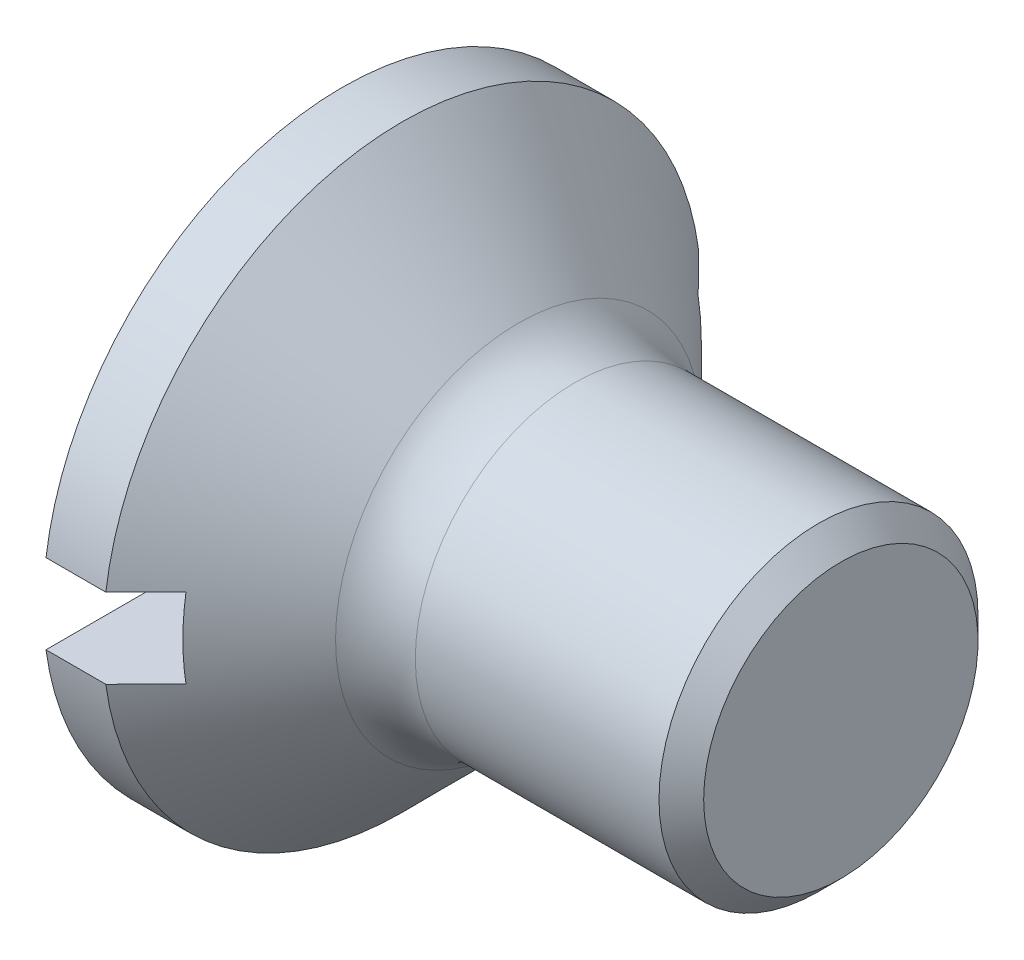
ISO-10303-21;
HEADER;
FILE_DESCRIPTION(('STEP AP214'),'2;1');
FILE_NAME('part.step','',(''),(''),'','','');
FILE_SCHEMA(('AUTOMOTIVE_DESIGN { 1 0 10303 214 1 1 1 1 }'));
ENDSEC;
DATA;
#1=APPLICATION_CONTEXT('core data for automotive mechanical design processes');
#2=APPLICATION_PROTOCOL_DEFINITION('international standard','automotive_design',2000,#1);
#3=PRODUCT_CONTEXT('',#1,'mechanical');
#4=PRODUCT('Part','Part','',(#3));
#5=PRODUCT_RELATED_PRODUCT_CATEGORY('part','',(#4));
#6=PRODUCT_DEFINITION_FORMATION('','',#4);
#7=PRODUCT_DEFINITION_CONTEXT('part definition',#1,'design');
#8=PRODUCT_DEFINITION('design','',#6,#7);
#9=PRODUCT_DEFINITION_SHAPE('','',#8);
#10=(LENGTH_UNIT() NAMED_UNIT(*) SI_UNIT(.MILLI.,.METRE.));
#11=(NAMED_UNIT(*) PLANE_ANGLE_UNIT() SI_UNIT($,.RADIAN.));
#12=(NAMED_UNIT(*) SI_UNIT($,.STERADIAN.) SOLID_ANGLE_UNIT());
#13=UNCERTAINTY_MEASURE_WITH_UNIT(LENGTH_MEASURE(1.E-05),#10,'distance_accuracy_value','');
#14=(GEOMETRIC_REPRESENTATION_CONTEXT(3) GLOBAL_UNCERTAINTY_ASSIGNED_CONTEXT((#13)) GLOBAL_UNIT_ASSIGNED_CONTEXT((#10,
#11,#12)) REPRESENTATION_CONTEXT('',''));
#15=CARTESIAN_POINT('',(0.,0.,0.));
#16=DIRECTION('',(0.,0.,1.));
#17=DIRECTION('',(1.,0.,0.));
#18=AXIS2_PLACEMENT_3D('',#15,#16,#17);
#19=CARTESIAN_POINT('',(0.,0.,0.));
#20=DIRECTION('',(-1.,0.,0.));
#21=DIRECTION('',(0.,0.,1.));
#22=AXIS2_PLACEMENT_3D('',#19,#20,#21);
#23=PLANE('',#22);
#24=DIRECTION('',(0.,0.,-1.));
#25=VECTOR('',#24,1.);
#26=CARTESIAN_POINT('',(0.,0.2,-1.5));
#27=LINE('',#26,#25);
#28=CARTESIAN_POINT('',(0.,0.2,1.48660687473185));
#29=VERTEX_POINT('',#28);
#30=CARTESIAN_POINT('',(0.,0.2,-1.48660687473185));
#31=VERTEX_POINT('',#30);
#32=EDGE_CURVE('E180',#29,#31,#27,.T.);
#33=ORIENTED_EDGE('',*,*,#32,.F.);
#34=CARTESIAN_POINT('',(0.,0.,0.));
#35=DIRECTION('',(1.,0.,0.));
#36=DIRECTION('',(0.,0.,-1.));
#37=AXIS2_PLACEMENT_3D('',#34,#35,#36);
#38=CIRCLE('',#37,1.5);
#39=EDGE_CURVE('E133',#31,#29,#38,.T.);
#40=ORIENTED_EDGE('',*,*,#39,.F.);
#41=EDGE_LOOP('',(#33,#40));
#42=FACE_BOUND('',#41,.T.);
#43=ADVANCED_FACE('F29',(#42),#23,.T.);
#44=CARTESIAN_POINT('',(0.,0.,0.));
#45=DIRECTION('',(1.,0.,0.));
#46=DIRECTION('',(0.,0.,-1.));
#47=AXIS2_PLACEMENT_3D('',#44,#45,#46);
#48=CYLINDRICAL_SURFACE('',#47,1.5);
#49=DIRECTION('',(1.,0.,0.));
#50=VECTOR('',#49,1.);
#51=CARTESIAN_POINT('',(0.,0.2,1.48660687473185));
#52=LINE('',#51,#50);
#53=CARTESIAN_POINT('',(0.299999999999992,0.2,1.48660687473185));
#54=VERTEX_POINT('',#53);
#55=EDGE_CURVE('E128',#54,#29,#52,.F.);
#56=ORIENTED_EDGE('',*,*,#55,.F.);
#57=CARTESIAN_POINT('',(0.299999999999992,0.,0.));
#58=DIRECTION('',(1.,0.,0.));
#59=DIRECTION('',(0.,0.,-1.));
#60=AXIS2_PLACEMENT_3D('',#57,#58,#59);
#61=CIRCLE('',#60,1.5);
#62=CARTESIAN_POINT('',(0.299999999999979,0.2,-1.48660687473187));
#63=VERTEX_POINT('',#62);
#64=EDGE_CURVE('E106',#63,#54,#61,.T.);
#65=ORIENTED_EDGE('',*,*,#64,.F.);
#66=DIRECTION('',(1.,0.,0.));
#67=VECTOR('',#66,1.);
#68=CARTESIAN_POINT('',(0.,0.2,-1.48660687473185));
#69=LINE('',#68,#67);
#70=EDGE_CURVE('E57',#31,#63,#69,.T.);
#71=ORIENTED_EDGE('',*,*,#70,.F.);
#72=ORIENTED_EDGE('',*,*,#39,.T.);
#73=EDGE_LOOP('',(#56,#65,#71,#72));
#74=FACE_BOUND('',#73,.T.);
#75=ADVANCED_FACE('F167',(#74),#48,.T.);
#76=DIRECTION('',(0.,0.,1.));
#77=VECTOR('',#76,1.);
#78=CARTESIAN_POINT('',(0.,-0.2,-1.5));
#79=LINE('',#78,#77);
#80=CARTESIAN_POINT('',(0.,-0.2,-1.48660687473185));
#81=VERTEX_POINT('',#80);
#82=CARTESIAN_POINT('',(0.,-0.2,1.48660687473185));
#83=VERTEX_POINT('',#82);
#84=EDGE_CURVE('E179',#81,#83,#79,.T.);
#85=ORIENTED_EDGE('',*,*,#84,.F.);
#86=EDGE_CURVE('E124',#83,#81,#38,.T.);
#87=ORIENTED_EDGE('',*,*,#86,.F.);
#88=EDGE_LOOP('',(#85,#87));
#89=FACE_BOUND('',#88,.T.);
#90=ADVANCED_FACE('F31',(#89),#23,.T.);
#91=DIRECTION('',(1.,0.,0.));
#92=VECTOR('',#91,1.);
#93=CARTESIAN_POINT('',(0.,-0.2,-1.48660687473185));
#94=LINE('',#93,#92);
#95=CARTESIAN_POINT('',(0.299999999999992,-0.2,-1.48660687473185));
#96=VERTEX_POINT('',#95);
#97=EDGE_CURVE('E100',#96,#81,#94,.F.);
#98=ORIENTED_EDGE('',*,*,#97,.F.);
#99=CARTESIAN_POINT('',(0.299999999999979,-0.2,1.48660687473187));
#100=VERTEX_POINT('',#99);
#101=EDGE_CURVE('E122',#100,#96,#61,.T.);
#102=ORIENTED_EDGE('',*,*,#101,.F.);
#103=DIRECTION('',(1.,0.,0.));
#104=VECTOR('',#103,1.);
#105=CARTESIAN_POINT('',(0.,-0.2,1.48660687473185));
#106=LINE('',#105,#104);
#107=EDGE_CURVE('E125',#83,#100,#106,.T.);
#108=ORIENTED_EDGE('',*,*,#107,.F.);
#109=ORIENTED_EDGE('',*,*,#86,.T.);
#110=EDGE_LOOP('',(#98,#102,#108,#109));
#111=FACE_BOUND('',#110,.T.);
#112=ADVANCED_FACE('F120',(#111),#48,.T.);
#113=CARTESIAN_POINT('',(1.,0.,0.));
#114=DIRECTION('',(-1.,0.,0.));
#115=DIRECTION('',(0.,0.,1.));
#116=AXIS2_PLACEMENT_3D('',#113,#114,#115);
#117=CONICAL_SURFACE('',#116,0.8,0.785398163397443);
#118=CARTESIAN_POINT('',(-1.50419556540476,0.2,-3.29813710061305));
#119=CARTESIAN_POINT('',(-1.39187074505558,0.2,-3.18560430389457));
#120=CARTESIAN_POINT('',(-1.27955493106123,0.2,-3.07306251017517));
#121=CARTESIAN_POINT('',(-1.05495121696581,0.2,-2.84794781080116));
#122=CARTESIAN_POINT('',(-0.94266331729389,0.2,-2.73537490471841));
#123=CARTESIAN_POINT('',(-0.71809188845246,0.2,-2.51015131621276));
#124=CARTESIAN_POINT('',(-0.605808372716796,0.2,-2.39750062039444));
#125=CARTESIAN_POINT('',(-0.381304830845298,0.2,-2.17213914027943));
#126=CARTESIAN_POINT('',(-0.269084803832679,0.2,-2.0594283568565));
#127=CARTESIAN_POINT('',(-0.0415428302026769,0.2,-1.83068842513929));
#128=CARTESIAN_POINT('',(0.0737762193000175,0.2,-1.71465639525681));
#129=CARTESIAN_POINT('',(0.30423605305017,0.2,-1.48240552454402));
#130=CARTESIAN_POINT('',(0.419376829633045,0.2,-1.36618667609681));
#131=CARTESIAN_POINT('',(0.591783806193686,0.2,-1.19158202815536));
#132=CARTESIAN_POINT('',(0.649196113019398,0.2,-1.13334052064913));
#133=CARTESIAN_POINT('',(0.76386710247512,0.2,-1.0167042462184));
#134=CARTESIAN_POINT('',(0.821125782499206,0.2,-0.958309476726992));
#135=CARTESIAN_POINT('',(0.9353767863234,0.2,-0.84126902362137));
#136=CARTESIAN_POINT('',(0.992369130476214,0.2,-0.78262335985827));
#137=CARTESIAN_POINT('',(1.10588035635338,0.2,-0.664876071669857));
#138=CARTESIAN_POINT('',(1.1623992555345,0.2,-0.605774464211744));
#139=CARTESIAN_POINT('',(1.23345859537781,0.2,-0.530092282195892));
#140=CARTESIAN_POINT('',(1.24850485858155,0.2,-0.513987685855619));
#141=CARTESIAN_POINT('',(1.27848716563841,0.2,-0.481675970387818));
#142=CARTESIAN_POINT('',(1.29342320780646,0.2,-0.465468849699881));
#143=CARTESIAN_POINT('',(1.33794795280147,0.2,-0.416738677945427));
#144=CARTESIAN_POINT('',(1.36733048041096,0.2,-0.384025163027556));
#145=CARTESIAN_POINT('',(1.41457658539492,0.2,-0.329636409240317));
#146=CARTESIAN_POINT('',(1.43276446840623,0.2,-0.308245935326427));
#147=CARTESIAN_POINT('',(1.46844471753178,0.2,-0.264736272906783));
#148=CARTESIAN_POINT('',(1.48593368945212,0.2,-0.242614303687193));
#149=CARTESIAN_POINT('',(1.51968071714485,0.2,-0.197038315698739));
#150=CARTESIAN_POINT('',(1.53592423450545,0.2,-0.173572921222353));
#151=CARTESIAN_POINT('',(1.55780111276227,0.2,-0.136939234401815));
#152=CARTESIAN_POINT('',(1.56466463800333,0.2,-0.12452145738415));
#153=CARTESIAN_POINT('',(1.57708917305988,0.2,-0.0990620110131141));
#154=CARTESIAN_POINT('',(1.58265289399768,0.2,-0.0860217098384467));
#155=CARTESIAN_POINT('',(1.5917792840782,0.2,-0.0592641489415997));
#156=CARTESIAN_POINT('',(1.59534814812518,0.2,-0.0455491304996564));
#157=CARTESIAN_POINT('',(1.59967768596158,0.2,-0.0177289077451682));
#158=CARTESIAN_POINT('',(1.60045475368906,0.2,-0.00362647294495521));
#159=CARTESIAN_POINT('',(1.59900556605575,0.2,0.024411946268896));
#160=CARTESIAN_POINT('',(1.5967787321953,0.2,0.0383478980993002));
#161=CARTESIAN_POINT('',(1.589918967225,0.2,0.065665684410535));
#162=CARTESIAN_POINT('',(1.58527022944925,0.2,0.0790432473908937));
#163=CARTESIAN_POINT('',(1.57285866465866,0.2,0.108737532035067));
#164=CARTESIAN_POINT('',(1.56458889196451,0.2,0.12483315456354));
#165=CARTESIAN_POINT('',(1.54656385534725,0.2,0.15618576499624));
#166=CARTESIAN_POINT('',(1.53680470726776,0.2,0.171440413847206));
#167=CARTESIAN_POINT('',(1.51634077459286,0.2,0.201453491024836));
#168=CARTESIAN_POINT('',(1.50562971697249,0.2,0.216207582089073));
#169=CARTESIAN_POINT('',(1.48366489106556,0.2,0.245269482353019));
#170=CARTESIAN_POINT('',(1.47241187362,0.2,0.259577866191512));
#171=CARTESIAN_POINT('',(1.43437262150192,0.2,0.306707898910077));
#172=CARTESIAN_POINT('',(1.40679821046022,0.2,0.338888873468126));
#173=CARTESIAN_POINT('',(1.35079129861572,0.2,0.402498627598434));
#174=CARTESIAN_POINT('',(1.32235846236458,0.2,0.433927104283918));
#175=CARTESIAN_POINT('',(1.26497830129008,0.2,0.49638834354062));
#176=CARTESIAN_POINT('',(1.23603034523076,0.2,0.527420527207309));
#177=CARTESIAN_POINT('',(1.177856042481,0.2,0.589210791647981));
#178=CARTESIAN_POINT('',(1.14862974652646,0.2,0.619968920470644));
#179=CARTESIAN_POINT('',(1.0610608525575,0.2,0.711588665292647));
#180=CARTESIAN_POINT('',(1.00245347991878,0.2,0.772197024940739));
#181=CARTESIAN_POINT('',(0.884939417977313,0.2,0.893042627015463));
#182=CARTESIAN_POINT('',(0.826032954311152,0.2,0.953280089950691));
#183=CARTESIAN_POINT('',(0.673530559048496,0.2,1.10872995598983));
#184=CARTESIAN_POINT('',(0.579789210108718,0.2,1.20379969800027));
#185=CARTESIAN_POINT('',(0.392078283407337,0.2,1.3937145890756));
#186=CARTESIAN_POINT('',(0.298108703799794,0.2,1.48855973631162));
#187=CARTESIAN_POINT('',(0.0159537169610171,0.2,1.77296530103758));
#188=CARTESIAN_POINT('',(-0.17242087781323,0.2,1.96233801915944));
#189=CARTESIAN_POINT('',(-0.551332427271327,0.2,2.34287303606238));
#190=CARTESIAN_POINT('',(-0.741871389023152,0.2,2.53403333324588));
#191=CARTESIAN_POINT('',(-1.12300037324722,0.2,2.91617981946181));
#192=CARTESIAN_POINT('',(-1.31359035931406,0.2,3.1071660447975));
#193=CARTESIAN_POINT('',(-1.50419556540476,0.2,3.29813710061305));
#194=B_SPLINE_CURVE_WITH_KNOTS('',3,(#118,#119,#120,#121,#122,#123,#124,#125,#126,#127,#128,
#129,#130,#131,#132,#133,#134,#135,#136,#137,#138,#139,#140,#141,#142,#143,#144,#145,#146,#147,
#148,#149,#150,#151,#152,#153,#154,#155,#156,#157,#158,#159,#160,#161,#162,#163,#164,#165,#166,
#167,#168,#169,#170,#171,#172,#173,#174,#175,#176,#177,#178,#179,#180,#181,#182,#183,#184,#185,
#186,#187,#188,#189,#190,#191,#192,#193),.UNSPECIFIED.,.F.,.F.,(4,2,2,2,2,2,2,2,2,2,2,2,2,2,2,2,
2,2,2,2,2,2,2,2,2,2,2,2,2,2,2,2,2,2,2,2,2,4),(0.,0.476995249326206,0.953997427125969,
1.43115557150536,1.90830695706106,2.39907900737591,2.88987160227246,3.13521659704299,
3.38056572754205,3.62589579201776,3.87121677055647,3.93733532415064,4.00345488649391,
4.13535690797288,4.21957607667633,4.30416401758087,4.38962345723483,4.4321417774645,
4.4745706053167,4.51686693045966,4.55891447414933,4.6009701166272,4.64330374085224,
4.69744658940574,4.75173312979668,4.80640853535568,4.86101025722418,4.98810135714711,
5.11524278041769,5.24255250858295,5.36983945868306,5.62276604001397,5.87552397385837,
6.27606149497902,6.67660226652569,7.47792751747088,8.28763501390273,9.09708081654247),.UNSPECIFIED.);
#195=CARTESIAN_POINT('',(0.5,0.2,-1.28452325786651));
#196=VERTEX_POINT('',#195);
#197=EDGE_CURVE('E11',#63,#196,#194,.T.);
#198=ORIENTED_EDGE('',*,*,#197,.F.);
#199=ORIENTED_EDGE('',*,*,#64,.T.);
#200=CARTESIAN_POINT('',(0.5,0.2,1.28452325786651));
#201=VERTEX_POINT('',#200);
#202=EDGE_CURVE('E33',#201,#54,#194,.T.);
#203=ORIENTED_EDGE('',*,*,#202,.F.);
#204=CARTESIAN_POINT('',(0.5,0.,0.));
#205=DIRECTION('',(-1.,0.,0.));
#206=DIRECTION('',(0.,0.,1.));
#207=AXIS2_PLACEMENT_3D('',#204,#205,#206);
#208=CIRCLE('',#207,1.29999999999999);
#209=CARTESIAN_POINT('',(0.5,-0.2,1.28452325786651));
#210=VERTEX_POINT('',#209);
#211=EDGE_CURVE('E86',#201,#210,#208,.F.);
#212=ORIENTED_EDGE('',*,*,#211,.T.);
#213=CARTESIAN_POINT('',(-1.50419556540476,-0.2,3.29813710061305));
#214=CARTESIAN_POINT('',(-1.39187074505558,-0.2,3.18560430389457));
#215=CARTESIAN_POINT('',(-1.27955493106123,-0.2,3.07306251017517));
#216=CARTESIAN_POINT('',(-1.05495121696581,-0.2,2.84794781080116));
#217=CARTESIAN_POINT('',(-0.94266331729389,-0.2,2.73537490471841));
#218=CARTESIAN_POINT('',(-0.71809188845246,-0.2,2.51015131621276));
#219=CARTESIAN_POINT('',(-0.605808372716796,-0.2,2.39750062039444));
#220=CARTESIAN_POINT('',(-0.381304830845298,-0.2,2.17213914027943));
#221=CARTESIAN_POINT('',(-0.269084803832679,-0.2,2.0594283568565));
#222=CARTESIAN_POINT('',(-0.0415428302026769,-0.2,1.83068842513929));
#223=CARTESIAN_POINT('',(0.0737762193000175,-0.2,1.71465639525681));
#224=CARTESIAN_POINT('',(0.30423605305017,-0.2,1.48240552454402));
#225=CARTESIAN_POINT('',(0.419376829633045,-0.2,1.36618667609681));
#226=CARTESIAN_POINT('',(0.591783806193686,-0.2,1.19158202815536));
#227=CARTESIAN_POINT('',(0.649196113019398,-0.2,1.13334052064913));
#228=CARTESIAN_POINT('',(0.76386710247512,-0.2,1.0167042462184));
#229=CARTESIAN_POINT('',(0.821125782499206,-0.2,0.958309476726992));
#230=CARTESIAN_POINT('',(0.9353767863234,-0.2,0.84126902362137));
#231=CARTESIAN_POINT('',(0.992369130476214,-0.2,0.78262335985827));
#232=CARTESIAN_POINT('',(1.10588035635338,-0.2,0.664876071669857));
#233=CARTESIAN_POINT('',(1.1623992555345,-0.2,0.605774464211744));
#234=CARTESIAN_POINT('',(1.23345859537781,-0.2,0.530092282195892));
#235=CARTESIAN_POINT('',(1.24850485858155,-0.2,0.513987685855619));
#236=CARTESIAN_POINT('',(1.27848716563841,-0.2,0.481675970387818));
#237=CARTESIAN_POINT('',(1.29342320780646,-0.2,0.465468849699881));
#238=CARTESIAN_POINT('',(1.33794795280147,-0.2,0.416738677945427));
#239=CARTESIAN_POINT('',(1.36733048041096,-0.2,0.384025163027556));
#240=CARTESIAN_POINT('',(1.41457658539492,-0.2,0.329636409240317));
#241=CARTESIAN_POINT('',(1.43276446840623,-0.2,0.308245935326427));
#242=CARTESIAN_POINT('',(1.46844471753178,-0.2,0.264736272906783));
#243=CARTESIAN_POINT('',(1.48593368945212,-0.2,0.242614303687193));
#244=CARTESIAN_POINT('',(1.51968071714485,-0.2,0.197038315698739));
#245=CARTESIAN_POINT('',(1.53592423450545,-0.2,0.173572921222353));
#246=CARTESIAN_POINT('',(1.55780111276227,-0.2,0.136939234401815));
#247=CARTESIAN_POINT('',(1.56466463800333,-0.2,0.12452145738415));
#248=CARTESIAN_POINT('',(1.57708917305988,-0.2,0.0990620110131141));
#249=CARTESIAN_POINT('',(1.58265289399768,-0.2,0.0860217098384467));
#250=CARTESIAN_POINT('',(1.5917792840782,-0.2,0.0592641489415997));
#251=CARTESIAN_POINT('',(1.59534814812518,-0.2,0.0455491304996564));
#252=CARTESIAN_POINT('',(1.59967768596158,-0.2,0.0177289077451682));
#253=CARTESIAN_POINT('',(1.60045475368906,-0.2,0.00362647294495521));
#254=CARTESIAN_POINT('',(1.59900556605575,-0.2,-0.024411946268896));
#255=CARTESIAN_POINT('',(1.5967787321953,-0.2,-0.0383478980993002));
#256=CARTESIAN_POINT('',(1.589918967225,-0.2,-0.065665684410535));
#257=CARTESIAN_POINT('',(1.58527022944925,-0.2,-0.0790432473908937));
#258=CARTESIAN_POINT('',(1.57285866465866,-0.2,-0.108737532035067));
#259=CARTESIAN_POINT('',(1.56458889196451,-0.2,-0.12483315456354));
#260=CARTESIAN_POINT('',(1.54656385534725,-0.2,-0.15618576499624));
#261=CARTESIAN_POINT('',(1.53680470726776,-0.2,-0.171440413847206));
#262=CARTESIAN_POINT('',(1.51634077459286,-0.2,-0.201453491024836));
#263=CARTESIAN_POINT('',(1.50562971697249,-0.2,-0.216207582089073));
#264=CARTESIAN_POINT('',(1.48366489106556,-0.2,-0.245269482353019));
#265=CARTESIAN_POINT('',(1.47241187362,-0.2,-0.259577866191512));
#266=CARTESIAN_POINT('',(1.43437262150192,-0.2,-0.306707898910077));
#267=CARTESIAN_POINT('',(1.40679821046022,-0.2,-0.338888873468126));
#268=CARTESIAN_POINT('',(1.35079129861572,-0.2,-0.402498627598434));
#269=CARTESIAN_POINT('',(1.32235846236458,-0.2,-0.433927104283918));
#270=CARTESIAN_POINT('',(1.26497830129008,-0.2,-0.49638834354062));
#271=CARTESIAN_POINT('',(1.23603034523076,-0.2,-0.527420527207309));
#272=CARTESIAN_POINT('',(1.177856042481,-0.2,-0.589210791647981));
#273=CARTESIAN_POINT('',(1.14862974652646,-0.2,-0.619968920470644));
#274=CARTESIAN_POINT('',(1.0610608525575,-0.2,-0.711588665292647));
#275=CARTESIAN_POINT('',(1.00245347991878,-0.2,-0.772197024940739));
#276=CARTESIAN_POINT('',(0.884939417977313,-0.2,-0.893042627015463));
#277=CARTESIAN_POINT('',(0.826032954311152,-0.2,-0.953280089950691));
#278=CARTESIAN_POINT('',(0.673530559048496,-0.2,-1.10872995598983));
#279=CARTESIAN_POINT('',(0.579789210108718,-0.2,-1.20379969800027));
#280=CARTESIAN_POINT('',(0.392078283407337,-0.2,-1.3937145890756));
#281=CARTESIAN_POINT('',(0.298108703799794,-0.2,-1.48855973631162));
#282=CARTESIAN_POINT('',(0.0159537169610171,-0.2,-1.77296530103758));
#283=CARTESIAN_POINT('',(-0.17242087781323,-0.2,-1.96233801915944));
#284=CARTESIAN_POINT('',(-0.551332427271327,-0.2,-2.34287303606238));
#285=CARTESIAN_POINT('',(-0.741871389023152,-0.2,-2.53403333324588));
#286=CARTESIAN_POINT('',(-1.12300037324722,-0.2,-2.91617981946181));
#287=CARTESIAN_POINT('',(-1.31359035931406,-0.2,-3.1071660447975));
#288=CARTESIAN_POINT('',(-1.50419556540476,-0.2,-3.29813710061305));
#289=B_SPLINE_CURVE_WITH_KNOTS('',3,(#213,#214,#215,#216,#217,#218,#219,#220,#221,#222,#223,
#224,#225,#226,#227,#228,#229,#230,#231,#232,#233,#234,#235,#236,#237,#238,#239,#240,#241,#242,
#243,#244,#245,#246,#247,#248,#249,#250,#251,#252,#253,#254,#255,#256,#257,#258,#259,#260,#261,
#262,#263,#264,#265,#266,#267,#268,#269,#270,#271,#272,#273,#274,#275,#276,#277,#278,#279,#280,
#281,#282,#283,#284,#285,#286,#287,#288),.UNSPECIFIED.,.F.,.F.,(4,2,2,2,2,2,2,2,2,2,2,2,2,2,2,2,
2,2,2,2,2,2,2,2,2,2,2,2,2,2,2,2,2,2,2,2,2,4),(0.,0.476995249326206,0.953997427125969,
1.43115557150536,1.90830695706106,2.39907900737591,2.88987160227246,3.13521659704299,
3.38056572754205,3.62589579201776,3.87121677055647,3.93733532415064,4.00345488649391,
4.13535690797288,4.21957607667633,4.30416401758087,4.38962345723483,4.4321417774645,
4.4745706053167,4.51686693045966,4.55891447414933,4.6009701166272,4.64330374085224,
4.69744658940574,4.75173312979668,4.80640853535568,4.86101025722418,4.98810135714711,
5.11524278041769,5.24255250858295,5.36983945868306,5.62276604001397,5.87552397385837,
6.27606149497902,6.67660226652569,7.47792751747088,8.28763501390273,9.09708081654247),.UNSPECIFIED.);
#290=EDGE_CURVE('E94',#100,#210,#289,.T.);
#291=ORIENTED_EDGE('',*,*,#290,.F.);
#292=ORIENTED_EDGE('',*,*,#101,.T.);
#293=CARTESIAN_POINT('',(0.5,-0.2,-1.28452325786651));
#294=VERTEX_POINT('',#293);
#295=EDGE_CURVE('E43',#294,#96,#289,.T.);
#296=ORIENTED_EDGE('',*,*,#295,.F.);
#297=EDGE_CURVE('E97',#294,#196,#208,.F.);
#298=ORIENTED_EDGE('',*,*,#297,.T.);
#299=EDGE_LOOP('',(#198,#199,#203,#212,#291,#292,#296,#298));
#300=FACE_BOUND('',#299,.T.);
#301=CARTESIAN_POINT('',(0.882842712474619,0.,0.));
#302=DIRECTION('',(-1.,0.,0.));
#303=DIRECTION('',(0.,0.,1.));
#304=AXIS2_PLACEMENT_3D('',#301,#302,#303);
#305=CIRCLE('',#304,0.917157287525379);
#306=CARTESIAN_POINT('',(0.882842712474619,0.,0.917157287525379));
#307=VERTEX_POINT('',#306);
#308=EDGE_CURVE('E137',#307,#307,#305,.T.);
#309=ORIENTED_EDGE('',*,*,#308,.T.);
#310=EDGE_LOOP('',(#309));
#311=FACE_BOUND('',#310,.T.);
#312=ADVANCED_FACE('F103',(#300,#311),#117,.T.);
#313=CARTESIAN_POINT('',(0.,0.,0.));
#314=DIRECTION('',(1.,0.,0.));
#315=DIRECTION('',(0.,0.,-1.));
#316=AXIS2_PLACEMENT_3D('',#313,#314,#315);
#317=CYLINDRICAL_SURFACE('',#316,0.8);
#318=CARTESIAN_POINT('',(2.388,0.,0.));
#319=DIRECTION('',(1.,0.,0.));
#320=DIRECTION('',(0.,0.,-1.));
#321=AXIS2_PLACEMENT_3D('',#318,#319,#320);
#322=CIRCLE('',#321,0.8);
#323=CARTESIAN_POINT('',(2.388,0.,0.8));
#324=VERTEX_POINT('',#323);
#325=EDGE_CURVE('E95',#324,#324,#322,.F.);
#326=ORIENTED_EDGE('',*,*,#325,.T.);
#327=EDGE_LOOP('',(#326));
#328=FACE_BOUND('',#327,.T.);
#329=CARTESIAN_POINT('',(1.16568542494924,0.,0.));
#330=DIRECTION('',(1.,0.,0.));
#331=DIRECTION('',(0.,0.,-1.));
#332=AXIS2_PLACEMENT_3D('',#329,#330,#331);
#333=CIRCLE('',#332,0.8);
#334=CARTESIAN_POINT('',(1.16568542494924,0.,-0.8));
#335=VERTEX_POINT('',#334);
#336=EDGE_CURVE('E134',#335,#335,#333,.T.);
#337=ORIENTED_EDGE('',*,*,#336,.T.);
#338=EDGE_LOOP('',(#337));
#339=FACE_BOUND('',#338,.T.);
#340=ADVANCED_FACE('F146',(#328,#339),#317,.T.);
#341=CARTESIAN_POINT('',(2.5,0.8,0.));
#342=DIRECTION('',(1.,0.,0.));
#343=DIRECTION('',(0.,0.,-1.));
#344=AXIS2_PLACEMENT_3D('',#341,#342,#343);
#345=PLANE('',#344);
#346=CARTESIAN_POINT('',(2.5,0.,0.));
#347=DIRECTION('',(1.,0.,0.));
#348=DIRECTION('',(0.,0.,-1.));
#349=AXIS2_PLACEMENT_3D('',#346,#347,#348);
#350=CIRCLE('',#349,0.687999999999999);
#351=CARTESIAN_POINT('',(2.5,0.,0.688));
#352=VERTEX_POINT('',#351);
#353=EDGE_CURVE('E140',#352,#352,#350,.T.);
#354=ORIENTED_EDGE('',*,*,#353,.T.);
#355=EDGE_LOOP('',(#354));
#356=FACE_BOUND('',#355,.T.);
#357=ADVANCED_FACE('F156',(#356),#345,.T.);
#358=CARTESIAN_POINT('',(1.16568542494924,0.,0.));
#359=DIRECTION('',(1.,0.,0.));
#360=DIRECTION('',(0.,0.,-1.));
#361=AXIS2_PLACEMENT_3D('',#358,#359,#360);
#362=TOROIDAL_SURFACE('',#361,1.2,0.4);
#363=ORIENTED_EDGE('',*,*,#308,.F.);
#364=EDGE_LOOP('',(#363));
#365=FACE_BOUND('',#364,.T.);
#366=ORIENTED_EDGE('',*,*,#336,.F.);
#367=EDGE_LOOP('',(#366));
#368=FACE_BOUND('',#367,.T.);
#369=ADVANCED_FACE('F152',(#365,#368),#362,.F.);
#370=CARTESIAN_POINT('',(2.5,0.,0.));
#371=DIRECTION('',(-1.,0.,0.));
#372=DIRECTION('',(0.,0.,1.));
#373=AXIS2_PLACEMENT_3D('',#370,#371,#372);
#374=CONICAL_SURFACE('',#373,0.687999999999999,0.785398163397447);
#375=CARTESIAN_POINT('',(2.388,0.,0.8));
#376=CARTESIAN_POINT('',(2.38916666666666,0.,0.798833333333334));
#377=CARTESIAN_POINT('',(2.39033333333333,0.,0.797666666666667));
#378=CARTESIAN_POINT('',(2.39266666666666,0.,0.795333333333334));
#379=CARTESIAN_POINT('',(2.39383333333333,0.,0.794166666666667));
#380=CARTESIAN_POINT('',(2.39616666666667,0.,0.791833333333334));
#381=CARTESIAN_POINT('',(2.39733333333333,0.,0.790666666666667));
#382=CARTESIAN_POINT('',(2.39966666666666,0.,0.788333333333334));
#383=CARTESIAN_POINT('',(2.40083333333333,0.,0.787166666666667));
#384=CARTESIAN_POINT('',(2.40316666666667,0.,0.784833333333334));
#385=CARTESIAN_POINT('',(2.40433333333333,0.,0.783666666666667));
#386=CARTESIAN_POINT('',(2.40666666666666,0.,0.781333333333334));
#387=CARTESIAN_POINT('',(2.40783333333333,0.,0.780166666666667));
#388=CARTESIAN_POINT('',(2.41016666666667,0.,0.777833333333334));
#389=CARTESIAN_POINT('',(2.41133333333333,0.,0.776666666666667));
#390=CARTESIAN_POINT('',(2.41366666666667,0.,0.774333333333334));
#391=CARTESIAN_POINT('',(2.41483333333333,0.,0.773166666666667));
#392=CARTESIAN_POINT('',(2.41716666666666,0.,0.770833333333334));
#393=CARTESIAN_POINT('',(2.41833333333333,0.,0.769666666666667));
#394=CARTESIAN_POINT('',(2.42066666666667,0.,0.767333333333334));
#395=CARTESIAN_POINT('',(2.42183333333333,0.,0.766166666666667));
#396=CARTESIAN_POINT('',(2.42416666666667,0.,0.763833333333333));
#397=CARTESIAN_POINT('',(2.42533333333333,0.,0.762666666666667));
#398=CARTESIAN_POINT('',(2.42766666666667,0.,0.760333333333333));
#399=CARTESIAN_POINT('',(2.42883333333333,0.,0.759166666666667));
#400=CARTESIAN_POINT('',(2.43116666666667,0.,0.756833333333333));
#401=CARTESIAN_POINT('',(2.43233333333333,0.,0.755666666666667));
#402=CARTESIAN_POINT('',(2.43466666666667,0.,0.753333333333333));
#403=CARTESIAN_POINT('',(2.43583333333333,0.,0.752166666666667));
#404=CARTESIAN_POINT('',(2.43816666666667,0.,0.749833333333333));
#405=CARTESIAN_POINT('',(2.43933333333333,0.,0.748666666666667));
#406=CARTESIAN_POINT('',(2.44166666666667,0.,0.746333333333333));
#407=CARTESIAN_POINT('',(2.44283333333333,0.,0.745166666666667));
#408=CARTESIAN_POINT('',(2.44516666666667,0.,0.742833333333333));
#409=CARTESIAN_POINT('',(2.44633333333333,0.,0.741666666666667));
#410=CARTESIAN_POINT('',(2.44866666666667,0.,0.739333333333333));
#411=CARTESIAN_POINT('',(2.44983333333333,0.,0.738166666666667));
#412=CARTESIAN_POINT('',(2.45216666666667,0.,0.735833333333333));
#413=CARTESIAN_POINT('',(2.45333333333333,0.,0.734666666666667));
#414=CARTESIAN_POINT('',(2.45566666666667,0.,0.732333333333333));
#415=CARTESIAN_POINT('',(2.45683333333333,0.,0.731166666666667));
#416=CARTESIAN_POINT('',(2.45916666666667,0.,0.728833333333333));
#417=CARTESIAN_POINT('',(2.46033333333333,0.,0.727666666666666));
#418=CARTESIAN_POINT('',(2.46266666666667,0.,0.725333333333333));
#419=CARTESIAN_POINT('',(2.46383333333333,0.,0.724166666666667));
#420=CARTESIAN_POINT('',(2.46616666666667,0.,0.721833333333333));
#421=CARTESIAN_POINT('',(2.46733333333333,0.,0.720666666666667));
#422=CARTESIAN_POINT('',(2.46966666666667,0.,0.718333333333333));
#423=CARTESIAN_POINT('',(2.47083333333333,0.,0.717166666666667));
#424=CARTESIAN_POINT('',(2.47316666666667,0.,0.714833333333333));
#425=CARTESIAN_POINT('',(2.47433333333333,0.,0.713666666666666));
#426=CARTESIAN_POINT('',(2.47666666666667,0.,0.711333333333333));
#427=CARTESIAN_POINT('',(2.47783333333333,0.,0.710166666666667));
#428=CARTESIAN_POINT('',(2.48016666666667,0.,0.707833333333333));
#429=CARTESIAN_POINT('',(2.48133333333333,0.,0.706666666666666));
#430=CARTESIAN_POINT('',(2.48366666666667,0.,0.704333333333333));
#431=CARTESIAN_POINT('',(2.48483333333333,0.,0.703166666666666));
#432=CARTESIAN_POINT('',(2.48716666666667,0.,0.700833333333333));
#433=CARTESIAN_POINT('',(2.48833333333333,0.,0.699666666666666));
#434=CARTESIAN_POINT('',(2.49066666666667,0.,0.697333333333333));
#435=CARTESIAN_POINT('',(2.49183333333333,0.,0.696166666666666));
#436=CARTESIAN_POINT('',(2.49416666666667,0.,0.693833333333333));
#437=CARTESIAN_POINT('',(2.49533333333333,0.,0.692666666666666));
#438=CARTESIAN_POINT('',(2.49766666666667,0.,0.690333333333333));
#439=CARTESIAN_POINT('',(2.49883333333333,0.,0.689166666666666));
#440=CARTESIAN_POINT('',(2.5,0.,0.688));
#441=B_SPLINE_CURVE_WITH_KNOTS('',3,(#375,#376,#377,#378,#379,#380,#381,#382,#383,#384,#385,
#386,#387,#388,#389,#390,#391,#392,#393,#394,#395,#396,#397,#398,#399,#400,#401,#402,#403,#404,
#405,#406,#407,#408,#409,#410,#411,#412,#413,#414,#415,#416,#417,#418,#419,#420,#421,#422,#423,
#424,#425,#426,#427,#428,#429,#430,#431,#432,#433,#434,#435,#436,#437,#438,#439,#440),
.UNSPECIFIED.,.F.,.F.,(4,2,2,2,2,2,2,2,2,2,2,2,2,2,2,2,2,2,2,2,2,2,2,2,2,2,2,2,2,2,2,2,4),(0.,
0.00494974746830588,0.00989949493661175,0.0148492424049176,0.0197989898732235,
0.0247487373415293,0.0296984848098352,0.0346482322781411,0.0395979797464469,0.0445477272147528,
0.0494974746830587,0.0544472221513646,0.0593969696196707,0.0643467170879766,0.0692964645562825,
0.074246212024588,0.0791959594928939,0.0841457069611998,0.0890954544295057,0.0940452018978116,
0.0989949493661174,0.103944696834423,0.108894444302729,0.113844191771035,0.118793939239341,
0.123743686707647,0.128693434175953,0.133643181644259,0.138592929112565,0.143542676580871,
0.148492424049176,0.153442171517482,0.158391918985788),.UNSPECIFIED.);
#442=EDGE_CURVE('BSEAM149',#324,#352,#441,.T.);
#443=ORIENTED_EDGE('',*,*,#325,.F.);
#444=ORIENTED_EDGE('',*,*,#353,.F.);
#445=ORIENTED_EDGE('',*,*,#442,.T.);
#446=ORIENTED_EDGE('',*,*,#442,.F.);
#447=EDGE_LOOP('',(#443,#445,#444,#446));
#448=FACE_BOUND('',#447,.T.);
#449=ADVANCED_FACE('F149',(#448),#374,.T.);
#450=CARTESIAN_POINT('',(0.5,0.2,-1.5));
#451=DIRECTION('',(0.,1.,0.));
#452=DIRECTION('',(0.,0.,1.));
#453=AXIS2_PLACEMENT_3D('',#450,#451,#452);
#454=PLANE('',#453);
#455=ORIENTED_EDGE('',*,*,#70,.T.);
#456=ORIENTED_EDGE('',*,*,#197,.T.);
#457=DIRECTION('',(0.,0.,-1.));
#458=VECTOR('',#457,1.);
#459=CARTESIAN_POINT('',(0.5,0.2,-1.5));
#460=LINE('',#459,#458);
#461=EDGE_CURVE('E89',#201,#196,#460,.T.);
#462=ORIENTED_EDGE('',*,*,#461,.F.);
#463=ORIENTED_EDGE('',*,*,#202,.T.);
#464=ORIENTED_EDGE('',*,*,#55,.T.);
#465=ORIENTED_EDGE('',*,*,#32,.T.);
#466=EDGE_LOOP('',(#455,#456,#462,#463,#464,#465));
#467=FACE_BOUND('',#466,.T.);
#468=ADVANCED_FACE('F98',(#467),#454,.F.);
#469=CARTESIAN_POINT('',(0.5,-0.2,-1.5));
#470=DIRECTION('',(0.,-1.,0.));
#471=DIRECTION('',(0.,0.,-1.));
#472=AXIS2_PLACEMENT_3D('',#469,#470,#471);
#473=PLANE('',#472);
#474=ORIENTED_EDGE('',*,*,#107,.T.);
#475=ORIENTED_EDGE('',*,*,#290,.T.);
#476=DIRECTION('',(0.,0.,1.));
#477=VECTOR('',#476,1.);
#478=CARTESIAN_POINT('',(0.5,-0.2,-1.5));
#479=LINE('',#478,#477);
#480=EDGE_CURVE('E50',#294,#210,#479,.T.);
#481=ORIENTED_EDGE('',*,*,#480,.F.);
#482=ORIENTED_EDGE('',*,*,#295,.T.);
#483=ORIENTED_EDGE('',*,*,#97,.T.);
#484=ORIENTED_EDGE('',*,*,#84,.T.);
#485=EDGE_LOOP('',(#474,#475,#481,#482,#483,#484));
#486=FACE_BOUND('',#485,.T.);
#487=ADVANCED_FACE('F114',(#486),#473,.F.);
#488=CARTESIAN_POINT('',(0.5,-0.2,-1.5));
#489=DIRECTION('',(-1.,0.,0.));
#490=DIRECTION('',(0.,0.,1.));
#491=AXIS2_PLACEMENT_3D('',#488,#489,#490);
#492=PLANE('',#491);
#493=ORIENTED_EDGE('',*,*,#480,.T.);
#494=ORIENTED_EDGE('',*,*,#211,.F.);
#495=ORIENTED_EDGE('',*,*,#461,.T.);
#496=ORIENTED_EDGE('',*,*,#297,.F.);
#497=EDGE_LOOP('',(#493,#494,#495,#496));
#498=FACE_BOUND('',#497,.T.);
#499=ADVANCED_FACE('F88',(#498),#492,.T.);
#500=CLOSED_SHELL('',(#43,#75,#90,#112,#312,#340,#357,#369,#449,#468,#487,#499));
#501=MANIFOLD_SOLID_BREP('B2',#500);
#502=ADVANCED_BREP_SHAPE_REPRESENTATION('',(#18,#501),#14);
#503=SHAPE_DEFINITION_REPRESENTATION(#9,#502);
ENDSEC;
END-ISO-10303-21;
